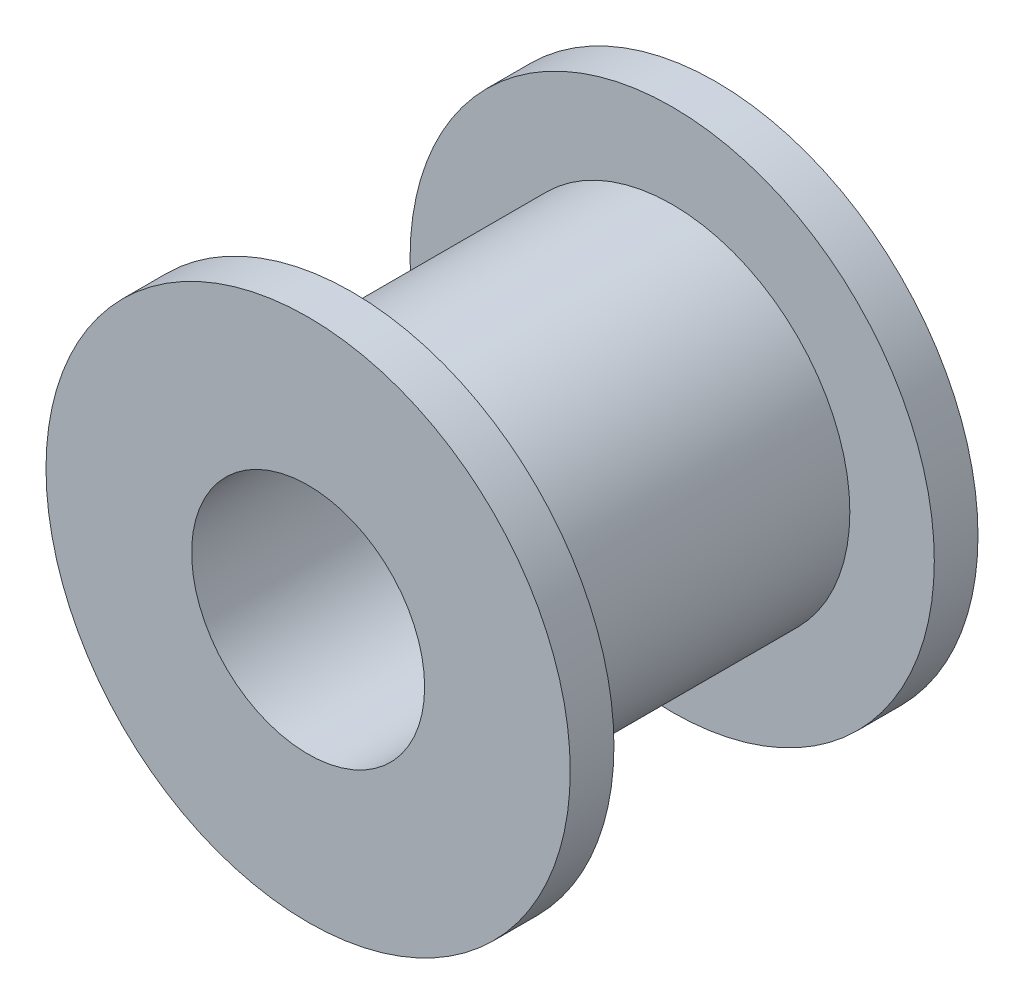
ISO-10303-21;
HEADER;
FILE_DESCRIPTION(('STEP AP214'),'2;1');
FILE_NAME('part.step','',(''),(''),'','','');
FILE_SCHEMA(('AUTOMOTIVE_DESIGN { 1 0 10303 214 1 1 1 1 }'));
ENDSEC;
DATA;
#1=APPLICATION_CONTEXT('core data for automotive mechanical design processes');
#2=APPLICATION_PROTOCOL_DEFINITION('international standard','automotive_design',2000,#1);
#3=PRODUCT_CONTEXT('',#1,'mechanical');
#4=PRODUCT('Part','Part','',(#3));
#5=PRODUCT_RELATED_PRODUCT_CATEGORY('part','',(#4));
#6=PRODUCT_DEFINITION_FORMATION('','',#4);
#7=PRODUCT_DEFINITION_CONTEXT('part definition',#1,'design');
#8=PRODUCT_DEFINITION('design','',#6,#7);
#9=PRODUCT_DEFINITION_SHAPE('','',#8);
#10=(LENGTH_UNIT() NAMED_UNIT(*) SI_UNIT(.MILLI.,.METRE.));
#11=(NAMED_UNIT(*) PLANE_ANGLE_UNIT() SI_UNIT($,.RADIAN.));
#12=(NAMED_UNIT(*) SI_UNIT($,.STERADIAN.) SOLID_ANGLE_UNIT());
#13=UNCERTAINTY_MEASURE_WITH_UNIT(LENGTH_MEASURE(1.E-05),#10,'distance_accuracy_value','');
#14=(GEOMETRIC_REPRESENTATION_CONTEXT(3) GLOBAL_UNCERTAINTY_ASSIGNED_CONTEXT((#13)) GLOBAL_UNIT_ASSIGNED_CONTEXT((#10,
#11,#12)) REPRESENTATION_CONTEXT('',''));
#15=CARTESIAN_POINT('',(0.,0.,0.));
#16=DIRECTION('',(0.,0.,1.));
#17=DIRECTION('',(1.,0.,0.));
#18=AXIS2_PLACEMENT_3D('',#15,#16,#17);
#19=CARTESIAN_POINT('',(0.,0.,1.5));
#20=DIRECTION('',(0.,0.,-1.));
#21=DIRECTION('',(-1.,0.,0.));
#22=AXIS2_PLACEMENT_3D('',#19,#20,#21);
#23=CYLINDRICAL_SURFACE('',#22,9.);
#24=CARTESIAN_POINT('',(0.,0.,1.5));
#25=DIRECTION('',(0.,0.,1.));
#26=DIRECTION('',(1.,0.,0.));
#27=AXIS2_PLACEMENT_3D('',#24,#25,#26);
#28=CIRCLE('',#27,9.);
#29=CARTESIAN_POINT('',(9.,0.,1.5));
#30=VERTEX_POINT('',#29);
#31=EDGE_CURVE('E45',#30,#30,#28,.T.);
#32=ORIENTED_EDGE('',*,*,#31,.F.);
#33=EDGE_LOOP('',(#32));
#34=FACE_BOUND('',#33,.T.);
#35=CARTESIAN_POINT('',(0.,0.,0.));
#36=DIRECTION('',(0.,0.,1.));
#37=DIRECTION('',(1.,0.,0.));
#38=AXIS2_PLACEMENT_3D('',#35,#36,#37);
#39=CIRCLE('',#38,9.);
#40=CARTESIAN_POINT('',(9.,0.,0.));
#41=VERTEX_POINT('',#40);
#42=EDGE_CURVE('E40',#41,#41,#39,.T.);
#43=ORIENTED_EDGE('',*,*,#42,.T.);
#44=EDGE_LOOP('',(#43));
#45=FACE_BOUND('',#44,.T.);
#46=ADVANCED_FACE('F37',(#34,#45),#23,.T.);
#47=CARTESIAN_POINT('',(0.,0.,1.5));
#48=DIRECTION('',(0.,0.,1.));
#49=DIRECTION('',(1.,0.,0.));
#50=AXIS2_PLACEMENT_3D('',#47,#48,#49);
#51=PLANE('',#50);
#52=CARTESIAN_POINT('',(0.,0.,1.5));
#53=DIRECTION('',(0.,0.,1.));
#54=DIRECTION('',(1.,0.,0.));
#55=AXIS2_PLACEMENT_3D('',#52,#53,#54);
#56=CIRCLE('',#55,6.1);
#57=CARTESIAN_POINT('',(6.1,0.,1.5));
#58=VERTEX_POINT('',#57);
#59=EDGE_CURVE('E10',#58,#58,#56,.T.);
#60=ORIENTED_EDGE('',*,*,#59,.F.);
#61=EDGE_LOOP('',(#60));
#62=FACE_BOUND('',#61,.T.);
#63=ORIENTED_EDGE('',*,*,#31,.T.);
#64=EDGE_LOOP('',(#63));
#65=FACE_BOUND('',#64,.T.);
#66=ADVANCED_FACE('F98',(#62,#65),#51,.T.);
#67=CARTESIAN_POINT('',(0.,0.,0.));
#68=DIRECTION('',(0.,0.,1.));
#69=DIRECTION('',(1.,0.,0.));
#70=AXIS2_PLACEMENT_3D('',#67,#68,#69);
#71=PLANE('',#70);
#72=CARTESIAN_POINT('',(0.,0.,0.));
#73=DIRECTION('',(0.,0.,1.));
#74=DIRECTION('',(1.,0.,0.));
#75=AXIS2_PLACEMENT_3D('',#72,#73,#74);
#76=CIRCLE('',#75,4.);
#77=CARTESIAN_POINT('',(4.,0.,0.));
#78=VERTEX_POINT('',#77);
#79=EDGE_CURVE('E61',#78,#78,#76,.T.);
#80=ORIENTED_EDGE('',*,*,#79,.T.);
#81=EDGE_LOOP('',(#80));
#82=FACE_BOUND('',#81,.T.);
#83=ORIENTED_EDGE('',*,*,#42,.F.);
#84=EDGE_LOOP('',(#83));
#85=FACE_BOUND('',#84,.T.);
#86=ADVANCED_FACE('F103',(#82,#85),#71,.F.);
#87=CARTESIAN_POINT('',(0.,0.,12.5));
#88=DIRECTION('',(0.,0.,-1.));
#89=DIRECTION('',(-1.,0.,0.));
#90=AXIS2_PLACEMENT_3D('',#87,#88,#89);
#91=CYLINDRICAL_SURFACE('',#90,6.1);
#92=CARTESIAN_POINT('',(0.,0.,12.5));
#93=DIRECTION('',(0.,0.,1.));
#94=DIRECTION('',(1.,0.,0.));
#95=AXIS2_PLACEMENT_3D('',#92,#93,#94);
#96=CIRCLE('',#95,6.1);
#97=CARTESIAN_POINT('',(6.1,0.,12.5));
#98=VERTEX_POINT('',#97);
#99=EDGE_CURVE('E52',#98,#98,#96,.T.);
#100=ORIENTED_EDGE('',*,*,#99,.F.);
#101=EDGE_LOOP('',(#100));
#102=FACE_BOUND('',#101,.T.);
#103=ORIENTED_EDGE('',*,*,#59,.T.);
#104=EDGE_LOOP('',(#103));
#105=FACE_BOUND('',#104,.T.);
#106=ADVANCED_FACE('F86',(#102,#105),#91,.T.);
#107=CARTESIAN_POINT('',(0.,0.,14.));
#108=DIRECTION('',(0.,0.,-1.));
#109=DIRECTION('',(-1.,0.,0.));
#110=AXIS2_PLACEMENT_3D('',#107,#108,#109);
#111=CYLINDRICAL_SURFACE('',#110,9.);
#112=CARTESIAN_POINT('',(0.,0.,14.));
#113=DIRECTION('',(0.,0.,1.));
#114=DIRECTION('',(1.,0.,0.));
#115=AXIS2_PLACEMENT_3D('',#112,#113,#114);
#116=CIRCLE('',#115,9.);
#117=CARTESIAN_POINT('',(9.,0.,14.));
#118=VERTEX_POINT('',#117);
#119=EDGE_CURVE('E56',#118,#118,#116,.T.);
#120=ORIENTED_EDGE('',*,*,#119,.F.);
#121=EDGE_LOOP('',(#120));
#122=FACE_BOUND('',#121,.T.);
#123=CARTESIAN_POINT('',(0.,0.,12.5));
#124=DIRECTION('',(0.,0.,1.));
#125=DIRECTION('',(1.,0.,0.));
#126=AXIS2_PLACEMENT_3D('',#123,#124,#125);
#127=CIRCLE('',#126,9.);
#128=CARTESIAN_POINT('',(9.,0.,12.5));
#129=VERTEX_POINT('',#128);
#130=EDGE_CURVE('E57',#129,#129,#127,.T.);
#131=ORIENTED_EDGE('',*,*,#130,.T.);
#132=EDGE_LOOP('',(#131));
#133=FACE_BOUND('',#132,.T.);
#134=ADVANCED_FACE('F80',(#122,#133),#111,.T.);
#135=CARTESIAN_POINT('',(0.,0.,14.));
#136=DIRECTION('',(0.,0.,1.));
#137=DIRECTION('',(1.,0.,0.));
#138=AXIS2_PLACEMENT_3D('',#135,#136,#137);
#139=PLANE('',#138);
#140=CARTESIAN_POINT('',(0.,0.,14.));
#141=DIRECTION('',(0.,0.,1.));
#142=DIRECTION('',(1.,0.,0.));
#143=AXIS2_PLACEMENT_3D('',#140,#141,#142);
#144=CIRCLE('',#143,4.);
#145=CARTESIAN_POINT('',(4.,0.,14.));
#146=VERTEX_POINT('',#145);
#147=EDGE_CURVE('E68',#146,#146,#144,.T.);
#148=ORIENTED_EDGE('',*,*,#147,.F.);
#149=EDGE_LOOP('',(#148));
#150=FACE_BOUND('',#149,.T.);
#151=ORIENTED_EDGE('',*,*,#119,.T.);
#152=EDGE_LOOP('',(#151));
#153=FACE_BOUND('',#152,.T.);
#154=ADVANCED_FACE('F76',(#150,#153),#139,.T.);
#155=CARTESIAN_POINT('',(0.,0.,12.5));
#156=DIRECTION('',(0.,0.,1.));
#157=DIRECTION('',(1.,0.,0.));
#158=AXIS2_PLACEMENT_3D('',#155,#156,#157);
#159=PLANE('',#158);
#160=ORIENTED_EDGE('',*,*,#99,.T.);
#161=EDGE_LOOP('',(#160));
#162=FACE_BOUND('',#161,.T.);
#163=ORIENTED_EDGE('',*,*,#130,.F.);
#164=EDGE_LOOP('',(#163));
#165=FACE_BOUND('',#164,.T.);
#166=ADVANCED_FACE('F79',(#162,#165),#159,.F.);
#167=CARTESIAN_POINT('',(0.,0.,-6.));
#168=DIRECTION('',(0.,0.,1.));
#169=DIRECTION('',(1.,0.,0.));
#170=AXIS2_PLACEMENT_3D('',#167,#168,#169);
#171=CYLINDRICAL_SURFACE('',#170,4.);
#172=ORIENTED_EDGE('',*,*,#147,.T.);
#173=EDGE_LOOP('',(#172));
#174=FACE_BOUND('',#173,.T.);
#175=ORIENTED_EDGE('',*,*,#79,.F.);
#176=EDGE_LOOP('',(#175));
#177=FACE_BOUND('',#176,.T.);
#178=ADVANCED_FACE('F73',(#174,#177),#171,.F.);
#179=CLOSED_SHELL('',(#46,#66,#86,#106,#134,#154,#166,#178));
#180=MANIFOLD_SOLID_BREP('B2',#179);
#181=ADVANCED_BREP_SHAPE_REPRESENTATION('',(#18,#180),#14);
#182=SHAPE_DEFINITION_REPRESENTATION(#9,#181);
ENDSEC;
END-ISO-10303-21;
